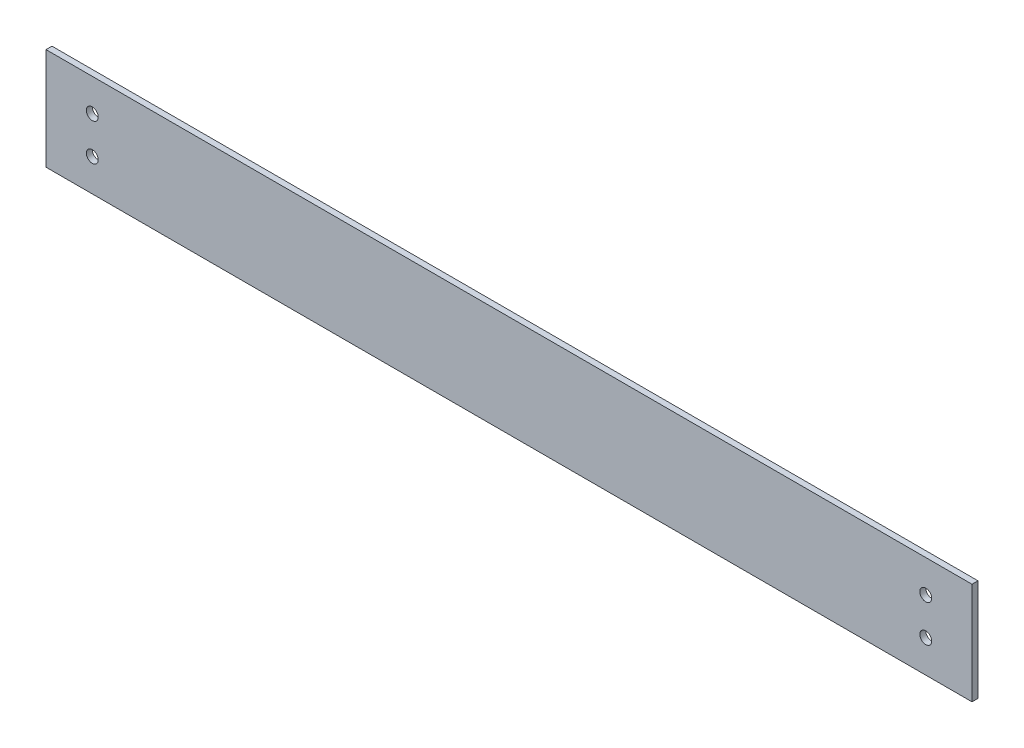
ISO-10303-21;
HEADER;
FILE_DESCRIPTION(('STEP AP214'),'2;1');
FILE_NAME('part.step','',(''),(''),'','','');
FILE_SCHEMA(('AUTOMOTIVE_DESIGN { 1 0 10303 214 1 1 1 1 }'));
ENDSEC;
DATA;
#1=APPLICATION_CONTEXT('core data for automotive mechanical design processes');
#2=APPLICATION_PROTOCOL_DEFINITION('international standard','automotive_design',2000,#1);
#3=PRODUCT_CONTEXT('',#1,'mechanical');
#4=PRODUCT('Part','Part','',(#3));
#5=PRODUCT_RELATED_PRODUCT_CATEGORY('part','',(#4));
#6=PRODUCT_DEFINITION_FORMATION('','',#4);
#7=PRODUCT_DEFINITION_CONTEXT('part definition',#1,'design');
#8=PRODUCT_DEFINITION('design','',#6,#7);
#9=PRODUCT_DEFINITION_SHAPE('','',#8);
#10=(LENGTH_UNIT() NAMED_UNIT(*) SI_UNIT(.MILLI.,.METRE.));
#11=(NAMED_UNIT(*) PLANE_ANGLE_UNIT() SI_UNIT($,.RADIAN.));
#12=(NAMED_UNIT(*) SI_UNIT($,.STERADIAN.) SOLID_ANGLE_UNIT());
#13=UNCERTAINTY_MEASURE_WITH_UNIT(LENGTH_MEASURE(1.E-05),#10,'distance_accuracy_value','');
#14=(GEOMETRIC_REPRESENTATION_CONTEXT(3) GLOBAL_UNCERTAINTY_ASSIGNED_CONTEXT((#13)) GLOBAL_UNIT_ASSIGNED_CONTEXT((#10,
#11,#12)) REPRESENTATION_CONTEXT('',''));
#15=CARTESIAN_POINT('',(0.,0.,0.));
#16=DIRECTION('',(0.,0.,1.));
#17=DIRECTION('',(1.,0.,0.));
#18=AXIS2_PLACEMENT_3D('',#15,#16,#17);
#19=CARTESIAN_POINT('',(0.,0.,1.6383));
#20=DIRECTION('',(1.,0.,0.));
#21=DIRECTION('',(0.,0.,-1.));
#22=AXIS2_PLACEMENT_3D('',#19,#20,#21);
#23=PLANE('',#22);
#24=DIRECTION('',(0.,-1.,0.));
#25=VECTOR('',#24,1.);
#26=CARTESIAN_POINT('',(0.,0.,0.));
#27=LINE('',#26,#25);
#28=CARTESIAN_POINT('',(0.,27.94,0.));
#29=VERTEX_POINT('',#28);
#30=CARTESIAN_POINT('',(0.,0.,0.));
#31=VERTEX_POINT('',#30);
#32=EDGE_CURVE('E107',#29,#31,#27,.T.);
#33=ORIENTED_EDGE('',*,*,#32,.T.);
#34=DIRECTION('',(0.,0.,-1.));
#35=VECTOR('',#34,1.);
#36=CARTESIAN_POINT('',(0.,0.,1.6383));
#37=LINE('',#36,#35);
#38=CARTESIAN_POINT('',(0.,0.,1.6383));
#39=VERTEX_POINT('',#38);
#40=EDGE_CURVE('E11',#39,#31,#37,.T.);
#41=ORIENTED_EDGE('',*,*,#40,.F.);
#42=DIRECTION('',(0.,-1.,0.));
#43=VECTOR('',#42,1.);
#44=CARTESIAN_POINT('',(0.,0.,1.6383));
#45=LINE('',#44,#43);
#46=CARTESIAN_POINT('',(0.,27.94,1.6383));
#47=VERTEX_POINT('',#46);
#48=EDGE_CURVE('E91',#47,#39,#45,.T.);
#49=ORIENTED_EDGE('',*,*,#48,.F.);
#50=DIRECTION('',(0.,0.,-1.));
#51=VECTOR('',#50,1.);
#52=CARTESIAN_POINT('',(0.,27.94,1.6383));
#53=LINE('',#52,#51);
#54=EDGE_CURVE('E103',#47,#29,#53,.T.);
#55=ORIENTED_EDGE('',*,*,#54,.T.);
#56=EDGE_LOOP('',(#33,#41,#49,#55));
#57=FACE_BOUND('',#56,.T.);
#58=ADVANCED_FACE('F39',(#57),#23,.F.);
#59=CARTESIAN_POINT('',(0.,0.,1.6383));
#60=DIRECTION('',(0.,1.,0.));
#61=DIRECTION('',(0.,0.,1.));
#62=AXIS2_PLACEMENT_3D('',#59,#60,#61);
#63=PLANE('',#62);
#64=DIRECTION('',(1.,0.,0.));
#65=VECTOR('',#64,1.);
#66=CARTESIAN_POINT('',(0.,0.,0.));
#67=LINE('',#66,#65);
#68=CARTESIAN_POINT('',(254.,0.,0.));
#69=VERTEX_POINT('',#68);
#70=EDGE_CURVE('E96',#31,#69,#67,.T.);
#71=ORIENTED_EDGE('',*,*,#70,.T.);
#72=DIRECTION('',(0.,0.,-1.));
#73=VECTOR('',#72,1.);
#74=CARTESIAN_POINT('',(254.,0.,1.6383));
#75=LINE('',#74,#73);
#76=CARTESIAN_POINT('',(254.,0.,1.6383));
#77=VERTEX_POINT('',#76);
#78=EDGE_CURVE('E48',#77,#69,#75,.T.);
#79=ORIENTED_EDGE('',*,*,#78,.F.);
#80=DIRECTION('',(1.,0.,0.));
#81=VECTOR('',#80,1.);
#82=CARTESIAN_POINT('',(0.,0.,1.6383));
#83=LINE('',#82,#81);
#84=EDGE_CURVE('E86',#39,#77,#83,.T.);
#85=ORIENTED_EDGE('',*,*,#84,.F.);
#86=ORIENTED_EDGE('',*,*,#40,.T.);
#87=EDGE_LOOP('',(#71,#79,#85,#86));
#88=FACE_BOUND('',#87,.T.);
#89=ADVANCED_FACE('F95',(#88),#63,.F.);
#90=CARTESIAN_POINT('',(254.,0.,1.6383));
#91=DIRECTION('',(-1.,0.,0.));
#92=DIRECTION('',(0.,0.,1.));
#93=AXIS2_PLACEMENT_3D('',#90,#91,#92);
#94=PLANE('',#93);
#95=DIRECTION('',(0.,1.,0.));
#96=VECTOR('',#95,1.);
#97=CARTESIAN_POINT('',(254.,0.,0.));
#98=LINE('',#97,#96);
#99=CARTESIAN_POINT('',(254.,27.94,0.));
#100=VERTEX_POINT('',#99);
#101=EDGE_CURVE('E73',#69,#100,#98,.T.);
#102=ORIENTED_EDGE('',*,*,#101,.T.);
#103=DIRECTION('',(0.,0.,-1.));
#104=VECTOR('',#103,1.);
#105=CARTESIAN_POINT('',(254.,27.94,1.6383));
#106=LINE('',#105,#104);
#107=CARTESIAN_POINT('',(254.,27.94,1.6383));
#108=VERTEX_POINT('',#107);
#109=EDGE_CURVE('E98',#108,#100,#106,.T.);
#110=ORIENTED_EDGE('',*,*,#109,.F.);
#111=DIRECTION('',(0.,1.,0.));
#112=VECTOR('',#111,1.);
#113=CARTESIAN_POINT('',(254.,0.,1.6383));
#114=LINE('',#113,#112);
#115=EDGE_CURVE('E89',#77,#108,#114,.T.);
#116=ORIENTED_EDGE('',*,*,#115,.F.);
#117=ORIENTED_EDGE('',*,*,#78,.T.);
#118=EDGE_LOOP('',(#102,#110,#116,#117));
#119=FACE_BOUND('',#118,.T.);
#120=ADVANCED_FACE('F99',(#119),#94,.F.);
#121=CARTESIAN_POINT('',(0.,27.94,1.6383));
#122=DIRECTION('',(0.,-1.,0.));
#123=DIRECTION('',(0.,0.,-1.));
#124=AXIS2_PLACEMENT_3D('',#121,#122,#123);
#125=PLANE('',#124);
#126=DIRECTION('',(-1.,0.,0.));
#127=VECTOR('',#126,1.);
#128=CARTESIAN_POINT('',(0.,27.94,0.));
#129=LINE('',#128,#127);
#130=EDGE_CURVE('E79',#100,#29,#129,.T.);
#131=ORIENTED_EDGE('',*,*,#130,.T.);
#132=ORIENTED_EDGE('',*,*,#54,.F.);
#133=DIRECTION('',(-1.,0.,0.));
#134=VECTOR('',#133,1.);
#135=CARTESIAN_POINT('',(0.,27.94,1.6383));
#136=LINE('',#135,#134);
#137=EDGE_CURVE('E56',#108,#47,#136,.T.);
#138=ORIENTED_EDGE('',*,*,#137,.F.);
#139=ORIENTED_EDGE('',*,*,#109,.T.);
#140=EDGE_LOOP('',(#131,#132,#138,#139));
#141=FACE_BOUND('',#140,.T.);
#142=ADVANCED_FACE('F121',(#141),#125,.F.);
#143=CARTESIAN_POINT('',(0.,0.,1.6383));
#144=DIRECTION('',(0.,0.,-1.));
#145=DIRECTION('',(-1.,0.,0.));
#146=AXIS2_PLACEMENT_3D('',#143,#144,#145);
#147=PLANE('',#146);
#148=CARTESIAN_POINT('',(12.7,19.05,1.6383));
#149=DIRECTION('',(0.,0.,1.));
#150=DIRECTION('',(-1.,0.,0.));
#151=AXIS2_PLACEMENT_3D('',#148,#149,#150);
#152=CIRCLE('',#151,1.63195);
#153=CARTESIAN_POINT('',(14.33195,19.05,1.6383));
#154=VERTEX_POINT('',#153);
#155=EDGE_CURVE('E145',#154,#154,#152,.T.);
#156=ORIENTED_EDGE('',*,*,#155,.F.);
#157=EDGE_LOOP('',(#156));
#158=FACE_BOUND('',#157,.T.);
#159=CARTESIAN_POINT('',(241.3,8.88999999999997,1.6383));
#160=DIRECTION('',(0.,0.,1.));
#161=DIRECTION('',(-1.,0.,0.));
#162=AXIS2_PLACEMENT_3D('',#159,#160,#161);
#163=CIRCLE('',#162,1.63195000000003);
#164=CARTESIAN_POINT('',(242.93195,8.88999999999997,1.6383));
#165=VERTEX_POINT('',#164);
#166=EDGE_CURVE('E136',#165,#165,#163,.T.);
#167=ORIENTED_EDGE('',*,*,#166,.F.);
#168=EDGE_LOOP('',(#167));
#169=FACE_BOUND('',#168,.T.);
#170=CARTESIAN_POINT('',(241.3,19.05,1.6383));
#171=DIRECTION('',(0.,0.,1.));
#172=DIRECTION('',(1.,0.,0.));
#173=AXIS2_PLACEMENT_3D('',#170,#171,#172);
#174=CIRCLE('',#173,1.63195000000003);
#175=CARTESIAN_POINT('',(242.93195,19.05,1.6383));
#176=VERTEX_POINT('',#175);
#177=EDGE_CURVE('E152',#176,#176,#174,.T.);
#178=ORIENTED_EDGE('',*,*,#177,.F.);
#179=EDGE_LOOP('',(#178));
#180=FACE_BOUND('',#179,.T.);
#181=CARTESIAN_POINT('',(12.7,8.88999999999997,1.6383));
#182=DIRECTION('',(0.,0.,1.));
#183=DIRECTION('',(1.,0.,0.));
#184=AXIS2_PLACEMENT_3D('',#181,#182,#183);
#185=CIRCLE('',#184,1.63195);
#186=CARTESIAN_POINT('',(14.33195,8.88999999999997,1.6383));
#187=VERTEX_POINT('',#186);
#188=EDGE_CURVE('E128',#187,#187,#185,.T.);
#189=ORIENTED_EDGE('',*,*,#188,.F.);
#190=EDGE_LOOP('',(#189));
#191=FACE_BOUND('',#190,.T.);
#192=ORIENTED_EDGE('',*,*,#48,.T.);
#193=ORIENTED_EDGE('',*,*,#84,.T.);
#194=ORIENTED_EDGE('',*,*,#115,.T.);
#195=ORIENTED_EDGE('',*,*,#137,.T.);
#196=EDGE_LOOP('',(#192,#193,#194,#195));
#197=FACE_BOUND('',#196,.T.);
#198=ADVANCED_FACE('F87',(#158,#169,#180,#191,#197),#147,.F.);
#199=CARTESIAN_POINT('',(0.,0.,0.));
#200=DIRECTION('',(0.,0.,-1.));
#201=DIRECTION('',(-1.,0.,0.));
#202=AXIS2_PLACEMENT_3D('',#199,#200,#201);
#203=PLANE('',#202);
#204=CARTESIAN_POINT('',(12.7,19.05,0.));
#205=DIRECTION('',(0.,0.,1.));
#206=DIRECTION('',(-1.,0.,0.));
#207=AXIS2_PLACEMENT_3D('',#204,#205,#206);
#208=CIRCLE('',#207,1.63195);
#209=CARTESIAN_POINT('',(14.33195,19.05,0.));
#210=VERTEX_POINT('',#209);
#211=EDGE_CURVE('E132',#210,#210,#208,.T.);
#212=ORIENTED_EDGE('',*,*,#211,.T.);
#213=EDGE_LOOP('',(#212));
#214=FACE_BOUND('',#213,.T.);
#215=CARTESIAN_POINT('',(241.3,8.88999999999997,0.));
#216=DIRECTION('',(0.,0.,1.));
#217=DIRECTION('',(-1.,0.,0.));
#218=AXIS2_PLACEMENT_3D('',#215,#216,#217);
#219=CIRCLE('',#218,1.63195000000003);
#220=CARTESIAN_POINT('',(242.93195,8.88999999999997,0.));
#221=VERTEX_POINT('',#220);
#222=EDGE_CURVE('E140',#221,#221,#219,.T.);
#223=ORIENTED_EDGE('',*,*,#222,.T.);
#224=EDGE_LOOP('',(#223));
#225=FACE_BOUND('',#224,.T.);
#226=CARTESIAN_POINT('',(241.3,19.05,0.));
#227=DIRECTION('',(0.,0.,1.));
#228=DIRECTION('',(1.,0.,0.));
#229=AXIS2_PLACEMENT_3D('',#226,#227,#228);
#230=CIRCLE('',#229,1.63195000000003);
#231=CARTESIAN_POINT('',(242.93195,19.05,0.));
#232=VERTEX_POINT('',#231);
#233=EDGE_CURVE('E141',#232,#232,#230,.T.);
#234=ORIENTED_EDGE('',*,*,#233,.T.);
#235=EDGE_LOOP('',(#234));
#236=FACE_BOUND('',#235,.T.);
#237=CARTESIAN_POINT('',(12.7,8.88999999999997,0.));
#238=DIRECTION('',(0.,0.,1.));
#239=DIRECTION('',(1.,0.,0.));
#240=AXIS2_PLACEMENT_3D('',#237,#238,#239);
#241=CIRCLE('',#240,1.63195);
#242=CARTESIAN_POINT('',(14.33195,8.88999999999997,0.));
#243=VERTEX_POINT('',#242);
#244=EDGE_CURVE('E111',#243,#243,#241,.T.);
#245=ORIENTED_EDGE('',*,*,#244,.T.);
#246=EDGE_LOOP('',(#245));
#247=FACE_BOUND('',#246,.T.);
#248=ORIENTED_EDGE('',*,*,#32,.F.);
#249=ORIENTED_EDGE('',*,*,#130,.F.);
#250=ORIENTED_EDGE('',*,*,#101,.F.);
#251=ORIENTED_EDGE('',*,*,#70,.F.);
#252=EDGE_LOOP('',(#248,#249,#250,#251));
#253=FACE_BOUND('',#252,.T.);
#254=ADVANCED_FACE('F124',(#214,#225,#236,#247,#253),#203,.T.);
#255=CARTESIAN_POINT('',(12.7,8.88999999999997,0.));
#256=DIRECTION('',(0.,0.,1.));
#257=DIRECTION('',(1.,0.,0.));
#258=AXIS2_PLACEMENT_3D('',#255,#256,#257);
#259=CYLINDRICAL_SURFACE('',#258,1.63195);
#260=CARTESIAN_POINT('',(14.33195,8.88999999999997,0.));
#261=CARTESIAN_POINT('',(14.33195,8.88999999999997,0.017065625));
#262=CARTESIAN_POINT('',(14.33195,8.88999999999997,0.03413125));
#263=CARTESIAN_POINT('',(14.33195,8.88999999999997,0.0682625));
#264=CARTESIAN_POINT('',(14.33195,8.88999999999997,0.085328125));
#265=CARTESIAN_POINT('',(14.33195,8.88999999999997,0.119459375));
#266=CARTESIAN_POINT('',(14.33195,8.88999999999997,0.136525));
#267=CARTESIAN_POINT('',(14.33195,8.88999999999997,0.17065625));
#268=CARTESIAN_POINT('',(14.33195,8.88999999999997,0.187721875));
#269=CARTESIAN_POINT('',(14.33195,8.88999999999997,0.221853125));
#270=CARTESIAN_POINT('',(14.33195,8.88999999999997,0.23891875));
#271=CARTESIAN_POINT('',(14.33195,8.88999999999997,0.27305));
#272=CARTESIAN_POINT('',(14.33195,8.88999999999997,0.290115625));
#273=CARTESIAN_POINT('',(14.33195,8.88999999999997,0.324246875));
#274=CARTESIAN_POINT('',(14.33195,8.88999999999997,0.3413125));
#275=CARTESIAN_POINT('',(14.33195,8.88999999999997,0.37544375));
#276=CARTESIAN_POINT('',(14.33195,8.88999999999997,0.392509375));
#277=CARTESIAN_POINT('',(14.33195,8.88999999999997,0.426640625));
#278=CARTESIAN_POINT('',(14.33195,8.88999999999997,0.44370625));
#279=CARTESIAN_POINT('',(14.33195,8.88999999999997,0.4778375));
#280=CARTESIAN_POINT('',(14.33195,8.88999999999997,0.494903125));
#281=CARTESIAN_POINT('',(14.33195,8.88999999999997,0.529034375));
#282=CARTESIAN_POINT('',(14.33195,8.88999999999997,0.5461));
#283=CARTESIAN_POINT('',(14.33195,8.88999999999997,0.58023125));
#284=CARTESIAN_POINT('',(14.33195,8.88999999999997,0.597296875));
#285=CARTESIAN_POINT('',(14.33195,8.88999999999997,0.631428125));
#286=CARTESIAN_POINT('',(14.33195,8.88999999999997,0.64849375));
#287=CARTESIAN_POINT('',(14.33195,8.88999999999997,0.682625));
#288=CARTESIAN_POINT('',(14.33195,8.88999999999997,0.699690625));
#289=CARTESIAN_POINT('',(14.33195,8.88999999999997,0.733821875));
#290=CARTESIAN_POINT('',(14.33195,8.88999999999997,0.7508875));
#291=CARTESIAN_POINT('',(14.33195,8.88999999999997,0.78501875));
#292=CARTESIAN_POINT('',(14.33195,8.88999999999997,0.802084375));
#293=CARTESIAN_POINT('',(14.33195,8.88999999999997,0.836215625));
#294=CARTESIAN_POINT('',(14.33195,8.88999999999997,0.85328125));
#295=CARTESIAN_POINT('',(14.33195,8.88999999999997,0.8874125));
#296=CARTESIAN_POINT('',(14.33195,8.88999999999997,0.904478125));
#297=CARTESIAN_POINT('',(14.33195,8.88999999999997,0.938609375));
#298=CARTESIAN_POINT('',(14.33195,8.88999999999997,0.955675));
#299=CARTESIAN_POINT('',(14.33195,8.88999999999997,0.98980625));
#300=CARTESIAN_POINT('',(14.33195,8.88999999999997,1.006871875));
#301=CARTESIAN_POINT('',(14.33195,8.88999999999997,1.041003125));
#302=CARTESIAN_POINT('',(14.33195,8.88999999999997,1.05806875));
#303=CARTESIAN_POINT('',(14.33195,8.88999999999997,1.0922));
#304=CARTESIAN_POINT('',(14.33195,8.88999999999997,1.109265625));
#305=CARTESIAN_POINT('',(14.33195,8.88999999999997,1.143396875));
#306=CARTESIAN_POINT('',(14.33195,8.88999999999997,1.1604625));
#307=CARTESIAN_POINT('',(14.33195,8.88999999999997,1.19459375));
#308=CARTESIAN_POINT('',(14.33195,8.88999999999997,1.211659375));
#309=CARTESIAN_POINT('',(14.33195,8.88999999999997,1.245790625));
#310=CARTESIAN_POINT('',(14.33195,8.88999999999997,1.26285625));
#311=CARTESIAN_POINT('',(14.33195,8.88999999999997,1.2969875));
#312=CARTESIAN_POINT('',(14.33195,8.88999999999997,1.314053125));
#313=CARTESIAN_POINT('',(14.33195,8.88999999999997,1.348184375));
#314=CARTESIAN_POINT('',(14.33195,8.88999999999997,1.36525));
#315=CARTESIAN_POINT('',(14.33195,8.88999999999997,1.39938125));
#316=CARTESIAN_POINT('',(14.33195,8.88999999999997,1.416446875));
#317=CARTESIAN_POINT('',(14.33195,8.88999999999997,1.450578125));
#318=CARTESIAN_POINT('',(14.33195,8.88999999999997,1.46764375));
#319=CARTESIAN_POINT('',(14.33195,8.88999999999997,1.501775));
#320=CARTESIAN_POINT('',(14.33195,8.88999999999997,1.518840625));
#321=CARTESIAN_POINT('',(14.33195,8.88999999999997,1.552971875));
#322=CARTESIAN_POINT('',(14.33195,8.88999999999997,1.5700375));
#323=CARTESIAN_POINT('',(14.33195,8.88999999999997,1.60416875));
#324=CARTESIAN_POINT('',(14.33195,8.88999999999997,1.621234375));
#325=CARTESIAN_POINT('',(14.33195,8.88999999999997,1.6383));
#326=B_SPLINE_CURVE_WITH_KNOTS('',3,(#260,#261,#262,#263,#264,#265,#266,#267,#268,#269,#270,
#271,#272,#273,#274,#275,#276,#277,#278,#279,#280,#281,#282,#283,#284,#285,#286,#287,#288,#289,
#290,#291,#292,#293,#294,#295,#296,#297,#298,#299,#300,#301,#302,#303,#304,#305,#306,#307,#308,
#309,#310,#311,#312,#313,#314,#315,#316,#317,#318,#319,#320,#321,#322,#323,#324,#325),
.UNSPECIFIED.,.F.,.F.,(4,2,2,2,2,2,2,2,2,2,2,2,2,2,2,2,2,2,2,2,2,2,2,2,2,2,2,2,2,2,2,2,4),(0.,
0.051196875,0.10239375,0.153590625,0.2047875,0.255984375,0.30718125,0.358378125,0.409575,
0.460771875,0.51196875,0.563165625,0.6143625,0.665559375,0.71675625,0.767953125,0.81915,
0.870346875,0.92154375,0.972740625,1.0239375,1.075134375,1.12633125,1.177528125,1.228725,
1.279921875,1.33111875,1.382315625,1.4335125,1.484709375,1.53590625,1.587103125,1.6383),.UNSPECIFIED.);
#327=EDGE_CURVE('BSEAM166',#243,#187,#326,.T.);
#328=ORIENTED_EDGE('',*,*,#244,.F.);
#329=ORIENTED_EDGE('',*,*,#188,.T.);
#330=ORIENTED_EDGE('',*,*,#327,.T.);
#331=ORIENTED_EDGE('',*,*,#327,.F.);
#332=EDGE_LOOP('',(#328,#330,#329,#331));
#333=FACE_BOUND('',#332,.T.);
#334=ADVANCED_FACE('F166',(#333),#259,.F.);
#335=CARTESIAN_POINT('',(241.3,19.05,0.));
#336=DIRECTION('',(0.,0.,1.));
#337=DIRECTION('',(1.,0.,0.));
#338=AXIS2_PLACEMENT_3D('',#335,#336,#337);
#339=CYLINDRICAL_SURFACE('',#338,1.63195000000003);
#340=CARTESIAN_POINT('',(242.93195,19.05,0.));
#341=CARTESIAN_POINT('',(242.93195,19.05,0.017065625));
#342=CARTESIAN_POINT('',(242.93195,19.05,0.03413125));
#343=CARTESIAN_POINT('',(242.93195,19.05,0.0682625));
#344=CARTESIAN_POINT('',(242.93195,19.05,0.085328125));
#345=CARTESIAN_POINT('',(242.93195,19.05,0.119459375));
#346=CARTESIAN_POINT('',(242.93195,19.05,0.136525));
#347=CARTESIAN_POINT('',(242.93195,19.05,0.17065625));
#348=CARTESIAN_POINT('',(242.93195,19.05,0.187721875));
#349=CARTESIAN_POINT('',(242.93195,19.05,0.221853125));
#350=CARTESIAN_POINT('',(242.93195,19.05,0.23891875));
#351=CARTESIAN_POINT('',(242.93195,19.05,0.27305));
#352=CARTESIAN_POINT('',(242.93195,19.05,0.290115625));
#353=CARTESIAN_POINT('',(242.93195,19.05,0.324246875));
#354=CARTESIAN_POINT('',(242.93195,19.05,0.3413125));
#355=CARTESIAN_POINT('',(242.93195,19.05,0.37544375));
#356=CARTESIAN_POINT('',(242.93195,19.05,0.392509375));
#357=CARTESIAN_POINT('',(242.93195,19.05,0.426640625));
#358=CARTESIAN_POINT('',(242.93195,19.05,0.44370625));
#359=CARTESIAN_POINT('',(242.93195,19.05,0.4778375));
#360=CARTESIAN_POINT('',(242.93195,19.05,0.494903125));
#361=CARTESIAN_POINT('',(242.93195,19.05,0.529034375));
#362=CARTESIAN_POINT('',(242.93195,19.05,0.5461));
#363=CARTESIAN_POINT('',(242.93195,19.05,0.58023125));
#364=CARTESIAN_POINT('',(242.93195,19.05,0.597296875));
#365=CARTESIAN_POINT('',(242.93195,19.05,0.631428125));
#366=CARTESIAN_POINT('',(242.93195,19.05,0.64849375));
#367=CARTESIAN_POINT('',(242.93195,19.05,0.682625));
#368=CARTESIAN_POINT('',(242.93195,19.05,0.699690625));
#369=CARTESIAN_POINT('',(242.93195,19.05,0.733821875));
#370=CARTESIAN_POINT('',(242.93195,19.05,0.7508875));
#371=CARTESIAN_POINT('',(242.93195,19.05,0.78501875));
#372=CARTESIAN_POINT('',(242.93195,19.05,0.802084375));
#373=CARTESIAN_POINT('',(242.93195,19.05,0.836215625));
#374=CARTESIAN_POINT('',(242.93195,19.05,0.85328125));
#375=CARTESIAN_POINT('',(242.93195,19.05,0.8874125));
#376=CARTESIAN_POINT('',(242.93195,19.05,0.904478125));
#377=CARTESIAN_POINT('',(242.93195,19.05,0.938609375));
#378=CARTESIAN_POINT('',(242.93195,19.05,0.955675));
#379=CARTESIAN_POINT('',(242.93195,19.05,0.98980625));
#380=CARTESIAN_POINT('',(242.93195,19.05,1.006871875));
#381=CARTESIAN_POINT('',(242.93195,19.05,1.041003125));
#382=CARTESIAN_POINT('',(242.93195,19.05,1.05806875));
#383=CARTESIAN_POINT('',(242.93195,19.05,1.0922));
#384=CARTESIAN_POINT('',(242.93195,19.05,1.109265625));
#385=CARTESIAN_POINT('',(242.93195,19.05,1.143396875));
#386=CARTESIAN_POINT('',(242.93195,19.05,1.1604625));
#387=CARTESIAN_POINT('',(242.93195,19.05,1.19459375));
#388=CARTESIAN_POINT('',(242.93195,19.05,1.211659375));
#389=CARTESIAN_POINT('',(242.93195,19.05,1.245790625));
#390=CARTESIAN_POINT('',(242.93195,19.05,1.26285625));
#391=CARTESIAN_POINT('',(242.93195,19.05,1.2969875));
#392=CARTESIAN_POINT('',(242.93195,19.05,1.314053125));
#393=CARTESIAN_POINT('',(242.93195,19.05,1.348184375));
#394=CARTESIAN_POINT('',(242.93195,19.05,1.36525));
#395=CARTESIAN_POINT('',(242.93195,19.05,1.39938125));
#396=CARTESIAN_POINT('',(242.93195,19.05,1.416446875));
#397=CARTESIAN_POINT('',(242.93195,19.05,1.450578125));
#398=CARTESIAN_POINT('',(242.93195,19.05,1.46764375));
#399=CARTESIAN_POINT('',(242.93195,19.05,1.501775));
#400=CARTESIAN_POINT('',(242.93195,19.05,1.518840625));
#401=CARTESIAN_POINT('',(242.93195,19.05,1.552971875));
#402=CARTESIAN_POINT('',(242.93195,19.05,1.5700375));
#403=CARTESIAN_POINT('',(242.93195,19.05,1.60416875));
#404=CARTESIAN_POINT('',(242.93195,19.05,1.621234375));
#405=CARTESIAN_POINT('',(242.93195,19.05,1.6383));
#406=B_SPLINE_CURVE_WITH_KNOTS('',3,(#340,#341,#342,#343,#344,#345,#346,#347,#348,#349,#350,
#351,#352,#353,#354,#355,#356,#357,#358,#359,#360,#361,#362,#363,#364,#365,#366,#367,#368,#369,
#370,#371,#372,#373,#374,#375,#376,#377,#378,#379,#380,#381,#382,#383,#384,#385,#386,#387,#388,
#389,#390,#391,#392,#393,#394,#395,#396,#397,#398,#399,#400,#401,#402,#403,#404,#405),
.UNSPECIFIED.,.F.,.F.,(4,2,2,2,2,2,2,2,2,2,2,2,2,2,2,2,2,2,2,2,2,2,2,2,2,2,2,2,2,2,2,2,4),(0.,
0.051196875,0.10239375,0.153590625,0.2047875,0.255984375,0.30718125,0.358378125,0.409575,
0.460771875,0.51196875,0.563165625,0.6143625,0.665559375,0.71675625,0.767953125,0.81915,
0.870346875,0.92154375,0.972740625,1.0239375,1.075134375,1.12633125,1.177528125,1.228725,
1.279921875,1.33111875,1.382315625,1.4335125,1.484709375,1.53590625,1.587103125,1.6383),.UNSPECIFIED.);
#407=EDGE_CURVE('BSEAM162',#232,#176,#406,.T.);
#408=ORIENTED_EDGE('',*,*,#233,.F.);
#409=ORIENTED_EDGE('',*,*,#177,.T.);
#410=ORIENTED_EDGE('',*,*,#407,.T.);
#411=ORIENTED_EDGE('',*,*,#407,.F.);
#412=EDGE_LOOP('',(#408,#410,#409,#411));
#413=FACE_BOUND('',#412,.T.);
#414=ADVANCED_FACE('F162',(#413),#339,.F.);
#415=CARTESIAN_POINT('',(241.3,8.88999999999997,0.));
#416=DIRECTION('',(0.,0.,1.));
#417=DIRECTION('',(1.,0.,0.));
#418=AXIS2_PLACEMENT_3D('',#415,#416,#417);
#419=CYLINDRICAL_SURFACE('',#418,1.63195000000003);
#420=CARTESIAN_POINT('',(242.93195,8.88999999999997,0.));
#421=CARTESIAN_POINT('',(242.93195,8.88999999999997,0.017065625));
#422=CARTESIAN_POINT('',(242.93195,8.88999999999997,0.03413125));
#423=CARTESIAN_POINT('',(242.93195,8.88999999999997,0.0682625));
#424=CARTESIAN_POINT('',(242.93195,8.88999999999997,0.085328125));
#425=CARTESIAN_POINT('',(242.93195,8.88999999999997,0.119459375));
#426=CARTESIAN_POINT('',(242.93195,8.88999999999997,0.136525));
#427=CARTESIAN_POINT('',(242.93195,8.88999999999997,0.17065625));
#428=CARTESIAN_POINT('',(242.93195,8.88999999999997,0.187721875));
#429=CARTESIAN_POINT('',(242.93195,8.88999999999997,0.221853125));
#430=CARTESIAN_POINT('',(242.93195,8.88999999999997,0.23891875));
#431=CARTESIAN_POINT('',(242.93195,8.88999999999997,0.27305));
#432=CARTESIAN_POINT('',(242.93195,8.88999999999997,0.290115625));
#433=CARTESIAN_POINT('',(242.93195,8.88999999999997,0.324246875));
#434=CARTESIAN_POINT('',(242.93195,8.88999999999997,0.3413125));
#435=CARTESIAN_POINT('',(242.93195,8.88999999999997,0.37544375));
#436=CARTESIAN_POINT('',(242.93195,8.88999999999997,0.392509375));
#437=CARTESIAN_POINT('',(242.93195,8.88999999999997,0.426640625));
#438=CARTESIAN_POINT('',(242.93195,8.88999999999997,0.44370625));
#439=CARTESIAN_POINT('',(242.93195,8.88999999999997,0.4778375));
#440=CARTESIAN_POINT('',(242.93195,8.88999999999997,0.494903125));
#441=CARTESIAN_POINT('',(242.93195,8.88999999999997,0.529034375));
#442=CARTESIAN_POINT('',(242.93195,8.88999999999997,0.5461));
#443=CARTESIAN_POINT('',(242.93195,8.88999999999997,0.58023125));
#444=CARTESIAN_POINT('',(242.93195,8.88999999999997,0.597296875));
#445=CARTESIAN_POINT('',(242.93195,8.88999999999997,0.631428125));
#446=CARTESIAN_POINT('',(242.93195,8.88999999999997,0.64849375));
#447=CARTESIAN_POINT('',(242.93195,8.88999999999997,0.682625));
#448=CARTESIAN_POINT('',(242.93195,8.88999999999997,0.699690625));
#449=CARTESIAN_POINT('',(242.93195,8.88999999999997,0.733821875));
#450=CARTESIAN_POINT('',(242.93195,8.88999999999997,0.7508875));
#451=CARTESIAN_POINT('',(242.93195,8.88999999999997,0.78501875));
#452=CARTESIAN_POINT('',(242.93195,8.88999999999997,0.802084375));
#453=CARTESIAN_POINT('',(242.93195,8.88999999999997,0.836215625));
#454=CARTESIAN_POINT('',(242.93195,8.88999999999997,0.85328125));
#455=CARTESIAN_POINT('',(242.93195,8.88999999999997,0.8874125));
#456=CARTESIAN_POINT('',(242.93195,8.88999999999997,0.904478125));
#457=CARTESIAN_POINT('',(242.93195,8.88999999999997,0.938609375));
#458=CARTESIAN_POINT('',(242.93195,8.88999999999997,0.955675));
#459=CARTESIAN_POINT('',(242.93195,8.88999999999997,0.98980625));
#460=CARTESIAN_POINT('',(242.93195,8.88999999999997,1.006871875));
#461=CARTESIAN_POINT('',(242.93195,8.88999999999997,1.041003125));
#462=CARTESIAN_POINT('',(242.93195,8.88999999999997,1.05806875));
#463=CARTESIAN_POINT('',(242.93195,8.88999999999997,1.0922));
#464=CARTESIAN_POINT('',(242.93195,8.88999999999997,1.109265625));
#465=CARTESIAN_POINT('',(242.93195,8.88999999999997,1.143396875));
#466=CARTESIAN_POINT('',(242.93195,8.88999999999997,1.1604625));
#467=CARTESIAN_POINT('',(242.93195,8.88999999999997,1.19459375));
#468=CARTESIAN_POINT('',(242.93195,8.88999999999997,1.211659375));
#469=CARTESIAN_POINT('',(242.93195,8.88999999999997,1.245790625));
#470=CARTESIAN_POINT('',(242.93195,8.88999999999997,1.26285625));
#471=CARTESIAN_POINT('',(242.93195,8.88999999999997,1.2969875));
#472=CARTESIAN_POINT('',(242.93195,8.88999999999997,1.314053125));
#473=CARTESIAN_POINT('',(242.93195,8.88999999999997,1.348184375));
#474=CARTESIAN_POINT('',(242.93195,8.88999999999997,1.36525));
#475=CARTESIAN_POINT('',(242.93195,8.88999999999997,1.39938125));
#476=CARTESIAN_POINT('',(242.93195,8.88999999999997,1.416446875));
#477=CARTESIAN_POINT('',(242.93195,8.88999999999997,1.450578125));
#478=CARTESIAN_POINT('',(242.93195,8.88999999999997,1.46764375));
#479=CARTESIAN_POINT('',(242.93195,8.88999999999997,1.501775));
#480=CARTESIAN_POINT('',(242.93195,8.88999999999997,1.518840625));
#481=CARTESIAN_POINT('',(242.93195,8.88999999999997,1.552971875));
#482=CARTESIAN_POINT('',(242.93195,8.88999999999997,1.5700375));
#483=CARTESIAN_POINT('',(242.93195,8.88999999999997,1.60416875));
#484=CARTESIAN_POINT('',(242.93195,8.88999999999997,1.621234375));
#485=CARTESIAN_POINT('',(242.93195,8.88999999999997,1.6383));
#486=B_SPLINE_CURVE_WITH_KNOTS('',3,(#420,#421,#422,#423,#424,#425,#426,#427,#428,#429,#430,
#431,#432,#433,#434,#435,#436,#437,#438,#439,#440,#441,#442,#443,#444,#445,#446,#447,#448,#449,
#450,#451,#452,#453,#454,#455,#456,#457,#458,#459,#460,#461,#462,#463,#464,#465,#466,#467,#468,
#469,#470,#471,#472,#473,#474,#475,#476,#477,#478,#479,#480,#481,#482,#483,#484,#485),
.UNSPECIFIED.,.F.,.F.,(4,2,2,2,2,2,2,2,2,2,2,2,2,2,2,2,2,2,2,2,2,2,2,2,2,2,2,2,2,2,2,2,4),(0.,
0.051196875,0.10239375,0.153590625,0.2047875,0.255984375,0.30718125,0.358378125,0.409575,
0.460771875,0.51196875,0.563165625,0.6143625,0.665559375,0.71675625,0.767953125,0.81915,
0.870346875,0.92154375,0.972740625,1.0239375,1.075134375,1.12633125,1.177528125,1.228725,
1.279921875,1.33111875,1.382315625,1.4335125,1.484709375,1.53590625,1.587103125,1.6383),.UNSPECIFIED.);
#487=EDGE_CURVE('BSEAM165',#221,#165,#486,.T.);
#488=ORIENTED_EDGE('',*,*,#222,.F.);
#489=ORIENTED_EDGE('',*,*,#166,.T.);
#490=ORIENTED_EDGE('',*,*,#487,.T.);
#491=ORIENTED_EDGE('',*,*,#487,.F.);
#492=EDGE_LOOP('',(#488,#490,#489,#491));
#493=FACE_BOUND('',#492,.T.);
#494=ADVANCED_FACE('F165',(#493),#419,.F.);
#495=CARTESIAN_POINT('',(12.7,19.05,0.));
#496=DIRECTION('',(0.,0.,1.));
#497=DIRECTION('',(1.,0.,0.));
#498=AXIS2_PLACEMENT_3D('',#495,#496,#497);
#499=CYLINDRICAL_SURFACE('',#498,1.63195);
#500=CARTESIAN_POINT('',(14.33195,19.05,0.));
#501=CARTESIAN_POINT('',(14.33195,19.05,0.017065625));
#502=CARTESIAN_POINT('',(14.33195,19.05,0.03413125));
#503=CARTESIAN_POINT('',(14.33195,19.05,0.0682625));
#504=CARTESIAN_POINT('',(14.33195,19.05,0.085328125));
#505=CARTESIAN_POINT('',(14.33195,19.05,0.119459375));
#506=CARTESIAN_POINT('',(14.33195,19.05,0.136525));
#507=CARTESIAN_POINT('',(14.33195,19.05,0.17065625));
#508=CARTESIAN_POINT('',(14.33195,19.05,0.187721875));
#509=CARTESIAN_POINT('',(14.33195,19.05,0.221853125));
#510=CARTESIAN_POINT('',(14.33195,19.05,0.23891875));
#511=CARTESIAN_POINT('',(14.33195,19.05,0.27305));
#512=CARTESIAN_POINT('',(14.33195,19.05,0.290115625));
#513=CARTESIAN_POINT('',(14.33195,19.05,0.324246875));
#514=CARTESIAN_POINT('',(14.33195,19.05,0.3413125));
#515=CARTESIAN_POINT('',(14.33195,19.05,0.37544375));
#516=CARTESIAN_POINT('',(14.33195,19.05,0.392509375));
#517=CARTESIAN_POINT('',(14.33195,19.05,0.426640625));
#518=CARTESIAN_POINT('',(14.33195,19.05,0.44370625));
#519=CARTESIAN_POINT('',(14.33195,19.05,0.4778375));
#520=CARTESIAN_POINT('',(14.33195,19.05,0.494903125));
#521=CARTESIAN_POINT('',(14.33195,19.05,0.529034375));
#522=CARTESIAN_POINT('',(14.33195,19.05,0.5461));
#523=CARTESIAN_POINT('',(14.33195,19.05,0.58023125));
#524=CARTESIAN_POINT('',(14.33195,19.05,0.597296875));
#525=CARTESIAN_POINT('',(14.33195,19.05,0.631428125));
#526=CARTESIAN_POINT('',(14.33195,19.05,0.64849375));
#527=CARTESIAN_POINT('',(14.33195,19.05,0.682625));
#528=CARTESIAN_POINT('',(14.33195,19.05,0.699690625));
#529=CARTESIAN_POINT('',(14.33195,19.05,0.733821875));
#530=CARTESIAN_POINT('',(14.33195,19.05,0.7508875));
#531=CARTESIAN_POINT('',(14.33195,19.05,0.78501875));
#532=CARTESIAN_POINT('',(14.33195,19.05,0.802084375));
#533=CARTESIAN_POINT('',(14.33195,19.05,0.836215625));
#534=CARTESIAN_POINT('',(14.33195,19.05,0.85328125));
#535=CARTESIAN_POINT('',(14.33195,19.05,0.8874125));
#536=CARTESIAN_POINT('',(14.33195,19.05,0.904478125));
#537=CARTESIAN_POINT('',(14.33195,19.05,0.938609375));
#538=CARTESIAN_POINT('',(14.33195,19.05,0.955675));
#539=CARTESIAN_POINT('',(14.33195,19.05,0.98980625));
#540=CARTESIAN_POINT('',(14.33195,19.05,1.006871875));
#541=CARTESIAN_POINT('',(14.33195,19.05,1.041003125));
#542=CARTESIAN_POINT('',(14.33195,19.05,1.05806875));
#543=CARTESIAN_POINT('',(14.33195,19.05,1.0922));
#544=CARTESIAN_POINT('',(14.33195,19.05,1.109265625));
#545=CARTESIAN_POINT('',(14.33195,19.05,1.143396875));
#546=CARTESIAN_POINT('',(14.33195,19.05,1.1604625));
#547=CARTESIAN_POINT('',(14.33195,19.05,1.19459375));
#548=CARTESIAN_POINT('',(14.33195,19.05,1.211659375));
#549=CARTESIAN_POINT('',(14.33195,19.05,1.245790625));
#550=CARTESIAN_POINT('',(14.33195,19.05,1.26285625));
#551=CARTESIAN_POINT('',(14.33195,19.05,1.2969875));
#552=CARTESIAN_POINT('',(14.33195,19.05,1.314053125));
#553=CARTESIAN_POINT('',(14.33195,19.05,1.348184375));
#554=CARTESIAN_POINT('',(14.33195,19.05,1.36525));
#555=CARTESIAN_POINT('',(14.33195,19.05,1.39938125));
#556=CARTESIAN_POINT('',(14.33195,19.05,1.416446875));
#557=CARTESIAN_POINT('',(14.33195,19.05,1.450578125));
#558=CARTESIAN_POINT('',(14.33195,19.05,1.46764375));
#559=CARTESIAN_POINT('',(14.33195,19.05,1.501775));
#560=CARTESIAN_POINT('',(14.33195,19.05,1.518840625));
#561=CARTESIAN_POINT('',(14.33195,19.05,1.552971875));
#562=CARTESIAN_POINT('',(14.33195,19.05,1.5700375));
#563=CARTESIAN_POINT('',(14.33195,19.05,1.60416875));
#564=CARTESIAN_POINT('',(14.33195,19.05,1.621234375));
#565=CARTESIAN_POINT('',(14.33195,19.05,1.6383));
#566=B_SPLINE_CURVE_WITH_KNOTS('',3,(#500,#501,#502,#503,#504,#505,#506,#507,#508,#509,#510,
#511,#512,#513,#514,#515,#516,#517,#518,#519,#520,#521,#522,#523,#524,#525,#526,#527,#528,#529,
#530,#531,#532,#533,#534,#535,#536,#537,#538,#539,#540,#541,#542,#543,#544,#545,#546,#547,#548,
#549,#550,#551,#552,#553,#554,#555,#556,#557,#558,#559,#560,#561,#562,#563,#564,#565),
.UNSPECIFIED.,.F.,.F.,(4,2,2,2,2,2,2,2,2,2,2,2,2,2,2,2,2,2,2,2,2,2,2,2,2,2,2,2,2,2,2,2,4),(0.,
0.051196875,0.10239375,0.153590625,0.2047875,0.255984375,0.30718125,0.358378125,0.409575,
0.460771875,0.51196875,0.563165625,0.6143625,0.665559375,0.71675625,0.767953125,0.81915,
0.870346875,0.92154375,0.972740625,1.0239375,1.075134375,1.12633125,1.177528125,1.228725,
1.279921875,1.33111875,1.382315625,1.4335125,1.484709375,1.53590625,1.587103125,1.6383),.UNSPECIFIED.);
#567=EDGE_CURVE('BSEAM227',#210,#154,#566,.T.);
#568=ORIENTED_EDGE('',*,*,#211,.F.);
#569=ORIENTED_EDGE('',*,*,#155,.T.);
#570=ORIENTED_EDGE('',*,*,#567,.T.);
#571=ORIENTED_EDGE('',*,*,#567,.F.);
#572=EDGE_LOOP('',(#568,#570,#569,#571));
#573=FACE_BOUND('',#572,.T.);
#574=ADVANCED_FACE('F227',(#573),#499,.F.);
#575=CLOSED_SHELL('',(#58,#89,#120,#142,#198,#254,#334,#414,#494,#574));
#576=MANIFOLD_SOLID_BREP('B2',#575);
#577=ADVANCED_BREP_SHAPE_REPRESENTATION('',(#18,#576),#14);
#578=SHAPE_DEFINITION_REPRESENTATION(#9,#577);
ENDSEC;
END-ISO-10303-21;
